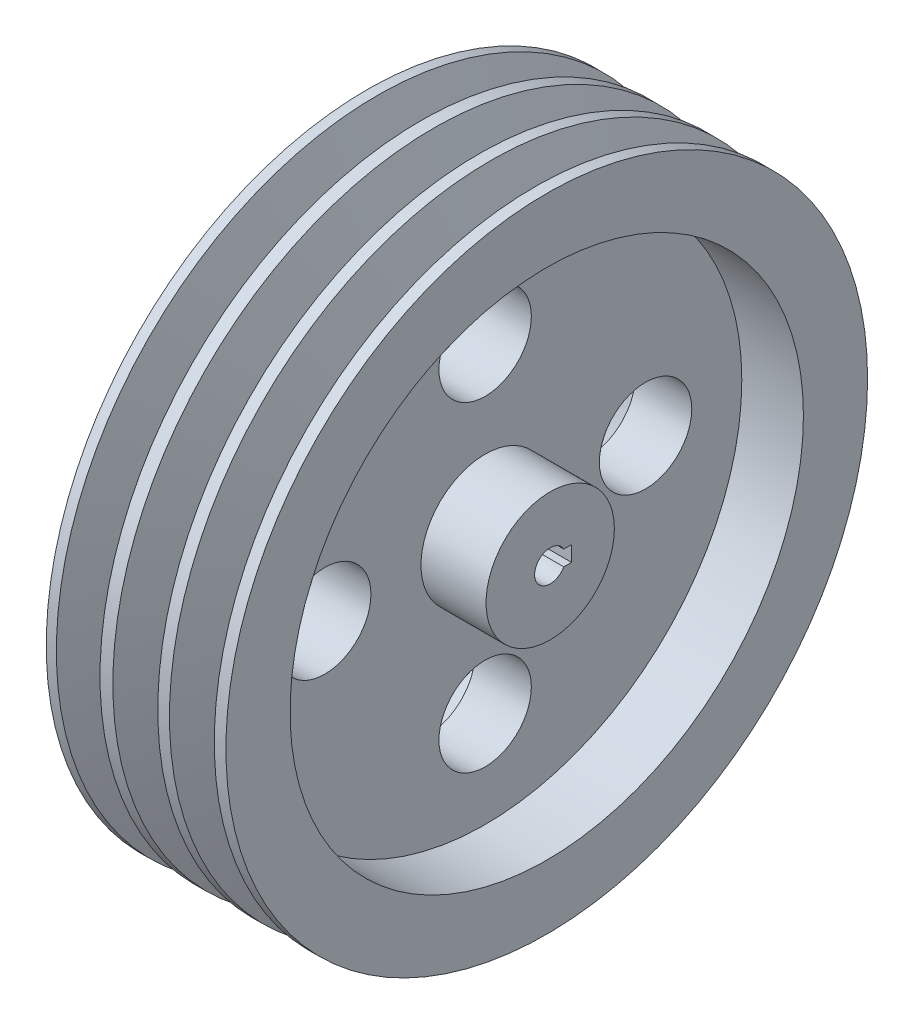
ISO-10303-21;
HEADER;
FILE_DESCRIPTION(('STEP AP214'),'2;1');
FILE_NAME('part.step','',(''),(''),'','','');
FILE_SCHEMA(('AUTOMOTIVE_DESIGN { 1 0 10303 214 1 1 1 1 }'));
ENDSEC;
DATA;
#1=APPLICATION_CONTEXT('core data for automotive mechanical design processes');
#2=APPLICATION_PROTOCOL_DEFINITION('international standard','automotive_design',2000,#1);
#3=PRODUCT_CONTEXT('',#1,'mechanical');
#4=PRODUCT('Part','Part','',(#3));
#5=PRODUCT_RELATED_PRODUCT_CATEGORY('part','',(#4));
#6=PRODUCT_DEFINITION_FORMATION('','',#4);
#7=PRODUCT_DEFINITION_CONTEXT('part definition',#1,'design');
#8=PRODUCT_DEFINITION('design','',#6,#7);
#9=PRODUCT_DEFINITION_SHAPE('','',#8);
#10=(LENGTH_UNIT() NAMED_UNIT(*) SI_UNIT(.MILLI.,.METRE.));
#11=(NAMED_UNIT(*) PLANE_ANGLE_UNIT() SI_UNIT($,.RADIAN.));
#12=(NAMED_UNIT(*) SI_UNIT($,.STERADIAN.) SOLID_ANGLE_UNIT());
#13=UNCERTAINTY_MEASURE_WITH_UNIT(LENGTH_MEASURE(1.E-05),#10,'distance_accuracy_value','');
#14=(GEOMETRIC_REPRESENTATION_CONTEXT(3) GLOBAL_UNCERTAINTY_ASSIGNED_CONTEXT((#13)) GLOBAL_UNIT_ASSIGNED_CONTEXT((#10,
#11,#12)) REPRESENTATION_CONTEXT('',''));
#15=CARTESIAN_POINT('',(0.,0.,0.));
#16=DIRECTION('',(0.,0.,1.));
#17=DIRECTION('',(1.,0.,0.));
#18=AXIS2_PLACEMENT_3D('',#15,#16,#17);
#19=CARTESIAN_POINT('',(0.,0.,0.));
#20=DIRECTION('',(1.,0.,0.));
#21=DIRECTION('',(0.,0.,-1.));
#22=AXIS2_PLACEMENT_3D('',#19,#20,#21);
#23=PLANE('',#22);
#24=CARTESIAN_POINT('',(0.,0.,0.));
#25=DIRECTION('',(1.,0.,0.));
#26=DIRECTION('',(0.,0.,-1.));
#27=AXIS2_PLACEMENT_3D('',#24,#25,#26);
#28=CIRCLE('',#27,25.);
#29=CARTESIAN_POINT('',(0.,0.,-25.));
#30=VERTEX_POINT('',#29);
#31=EDGE_CURVE('E108',#30,#30,#28,.T.);
#32=ORIENTED_EDGE('',*,*,#31,.F.);
#33=EDGE_LOOP('',(#32));
#34=FACE_BOUND('',#33,.T.);
#35=DIRECTION('',(0.,0.,1.));
#36=VECTOR('',#35,1.);
#37=CARTESIAN_POINT('',(0.,-3.,0.));
#38=LINE('',#37,#36);
#39=CARTESIAN_POINT('',(0.,-3.,-8.29200838994542));
#40=VERTEX_POINT('',#39);
#41=CARTESIAN_POINT('',(0.,-3.,-5.29200838994542));
#42=VERTEX_POINT('',#41);
#43=EDGE_CURVE('E188',#40,#42,#38,.T.);
#44=ORIENTED_EDGE('',*,*,#43,.F.);
#45=DIRECTION('',(0.,-1.,0.));
#46=VECTOR('',#45,1.);
#47=CARTESIAN_POINT('',(0.,0.,-8.29200838994542));
#48=LINE('',#47,#46);
#49=CARTESIAN_POINT('',(0.,3.,-8.29200838994542));
#50=VERTEX_POINT('',#49);
#51=EDGE_CURVE('E63',#50,#40,#48,.T.);
#52=ORIENTED_EDGE('',*,*,#51,.F.);
#53=DIRECTION('',(0.,0.,-1.));
#54=VECTOR('',#53,1.);
#55=CARTESIAN_POINT('',(0.,3.,0.));
#56=LINE('',#55,#54);
#57=CARTESIAN_POINT('',(0.,3.00000000000001,-5.29200838994542));
#58=VERTEX_POINT('',#57);
#59=EDGE_CURVE('E186',#58,#50,#56,.T.);
#60=ORIENTED_EDGE('',*,*,#59,.F.);
#61=CARTESIAN_POINT('',(0.,0.,0.));
#62=DIRECTION('',(1.,0.,0.));
#63=DIRECTION('',(0.,0.,-1.));
#64=AXIS2_PLACEMENT_3D('',#61,#62,#63);
#65=CIRCLE('',#64,6.08320251177392);
#66=EDGE_CURVE('E100',#58,#42,#65,.T.);
#67=ORIENTED_EDGE('',*,*,#66,.T.);
#68=EDGE_LOOP('',(#44,#52,#60,#67));
#69=FACE_BOUND('',#68,.T.);
#70=ADVANCED_FACE('F41',(#34,#69),#23,.F.);
#71=CARTESIAN_POINT('',(70.,0.,0.));
#72=DIRECTION('',(1.,0.,0.));
#73=DIRECTION('',(0.,0.,-1.));
#74=AXIS2_PLACEMENT_3D('',#71,#72,#73);
#75=CYLINDRICAL_SURFACE('',#74,6.08320251177393);
#76=CARTESIAN_POINT('',(70.,0.,0.));
#77=DIRECTION('',(1.,0.,0.));
#78=DIRECTION('',(0.,0.,-1.));
#79=AXIS2_PLACEMENT_3D('',#76,#77,#78);
#80=CIRCLE('',#79,6.08320251177394);
#81=CARTESIAN_POINT('',(70.,3.00000000000001,-5.2920083899454));
#82=VERTEX_POINT('',#81);
#83=CARTESIAN_POINT('',(70.,-3.,-5.29200838994541));
#84=VERTEX_POINT('',#83);
#85=EDGE_CURVE('E98',#82,#84,#80,.T.);
#86=ORIENTED_EDGE('',*,*,#85,.T.);
#87=DIRECTION('',(1.,0.,0.));
#88=VECTOR('',#87,1.);
#89=CARTESIAN_POINT('',(-1.34886382225793,-3.,-5.29200838994542));
#90=LINE('',#89,#88);
#91=EDGE_CURVE('E101',#42,#84,#90,.T.);
#92=ORIENTED_EDGE('',*,*,#91,.F.);
#93=ORIENTED_EDGE('',*,*,#66,.F.);
#94=DIRECTION('',(1.,0.,0.));
#95=VECTOR('',#94,1.);
#96=CARTESIAN_POINT('',(-1.34886382225793,3.00000000000001,-5.29200838994542));
#97=LINE('',#96,#95);
#98=EDGE_CURVE('E86',#58,#82,#97,.T.);
#99=ORIENTED_EDGE('',*,*,#98,.T.);
#100=EDGE_LOOP('',(#86,#92,#93,#99));
#101=FACE_BOUND('',#100,.T.);
#102=ADVANCED_FACE('F96',(#101),#75,.F.);
#103=CARTESIAN_POINT('',(70.,0.,0.));
#104=DIRECTION('',(1.,0.,0.));
#105=DIRECTION('',(0.,0.,-1.));
#106=AXIS2_PLACEMENT_3D('',#103,#104,#105);
#107=PLANE('',#106);
#108=CARTESIAN_POINT('',(70.,0.,0.));
#109=DIRECTION('',(1.,0.,0.));
#110=DIRECTION('',(0.,0.,-1.));
#111=AXIS2_PLACEMENT_3D('',#108,#109,#110);
#112=CIRCLE('',#111,25.);
#113=CARTESIAN_POINT('',(70.,0.,-25.));
#114=VERTEX_POINT('',#113);
#115=EDGE_CURVE('E106',#114,#114,#112,.T.);
#116=ORIENTED_EDGE('',*,*,#115,.T.);
#117=EDGE_LOOP('',(#116));
#118=FACE_BOUND('',#117,.T.);
#119=DIRECTION('',(0.,-1.,0.));
#120=VECTOR('',#119,1.);
#121=CARTESIAN_POINT('',(70.,0.,-8.2920083899454));
#122=LINE('',#121,#120);
#123=CARTESIAN_POINT('',(70.,3.,-8.29200838994542));
#124=VERTEX_POINT('',#123);
#125=CARTESIAN_POINT('',(70.,-3.,-8.29200838994541));
#126=VERTEX_POINT('',#125);
#127=EDGE_CURVE('E58',#124,#126,#122,.T.);
#128=ORIENTED_EDGE('',*,*,#127,.T.);
#129=DIRECTION('',(0.,0.,1.));
#130=VECTOR('',#129,1.);
#131=CARTESIAN_POINT('',(70.,-3.,0.));
#132=LINE('',#131,#130);
#133=EDGE_CURVE('E91',#126,#84,#132,.T.);
#134=ORIENTED_EDGE('',*,*,#133,.T.);
#135=ORIENTED_EDGE('',*,*,#85,.F.);
#136=DIRECTION('',(0.,0.,-1.));
#137=VECTOR('',#136,1.);
#138=CARTESIAN_POINT('',(70.,3.,0.));
#139=LINE('',#138,#137);
#140=EDGE_CURVE('E83',#82,#124,#139,.T.);
#141=ORIENTED_EDGE('',*,*,#140,.T.);
#142=EDGE_LOOP('',(#128,#134,#135,#141));
#143=FACE_BOUND('',#142,.T.);
#144=ADVANCED_FACE('F104',(#118,#143),#107,.T.);
#145=CARTESIAN_POINT('',(70.,0.,0.));
#146=DIRECTION('',(1.,0.,0.));
#147=DIRECTION('',(0.,0.,-1.));
#148=AXIS2_PLACEMENT_3D('',#145,#146,#147);
#149=CYLINDRICAL_SURFACE('',#148,125.);
#150=CARTESIAN_POINT('',(64.1219953260686,0.,0.));
#151=DIRECTION('',(1.,0.,0.));
#152=DIRECTION('',(0.,0.,-1.));
#153=AXIS2_PLACEMENT_3D('',#150,#151,#152);
#154=CIRCLE('',#153,125.);
#155=CARTESIAN_POINT('',(64.1219953260687,0.,-125.));
#156=VERTEX_POINT('',#155);
#157=EDGE_CURVE('E11',#156,#156,#154,.T.);
#158=ORIENTED_EDGE('',*,*,#157,.T.);
#159=EDGE_LOOP('',(#158));
#160=FACE_BOUND('',#159,.T.);
#161=CARTESIAN_POINT('',(68.651136177742,0.,0.));
#162=DIRECTION('',(1.,0.,0.));
#163=DIRECTION('',(0.,0.,-1.));
#164=AXIS2_PLACEMENT_3D('',#161,#162,#163);
#165=CIRCLE('',#164,125.);
#166=CARTESIAN_POINT('',(68.6511361777421,0.,-125.));
#167=VERTEX_POINT('',#166);
#168=EDGE_CURVE('E191',#167,#167,#165,.T.);
#169=ORIENTED_EDGE('',*,*,#168,.F.);
#170=EDGE_LOOP('',(#169));
#171=FACE_BOUND('',#170,.T.);
#172=ADVANCED_FACE('F43',(#160,#171),#149,.T.);
#173=CARTESIAN_POINT('',(64.1219953260686,0.,0.));
#174=DIRECTION('',(1.,0.,0.));
#175=DIRECTION('',(0.,0.,-1.));
#176=AXIS2_PLACEMENT_3D('',#173,#174,#175);
#177=CONICAL_SURFACE('',#176,125.,1.21610779152509);
#178=CARTESIAN_POINT('',(57.4556790220797,0.,0.));
#179=DIRECTION('',(1.,0.,0.));
#180=DIRECTION('',(0.,0.,-1.));
#181=AXIS2_PLACEMENT_3D('',#178,#179,#180);
#182=CIRCLE('',#181,107.);
#183=CARTESIAN_POINT('',(57.4556790220797,0.,-107.));
#184=VERTEX_POINT('',#183);
#185=EDGE_CURVE('E50',#184,#184,#182,.T.);
#186=ORIENTED_EDGE('',*,*,#185,.T.);
#187=EDGE_LOOP('',(#186));
#188=FACE_BOUND('',#187,.T.);
#189=ORIENTED_EDGE('',*,*,#157,.F.);
#190=EDGE_LOOP('',(#189));
#191=FACE_BOUND('',#190,.T.);
#192=ADVANCED_FACE('F225',(#188,#191),#177,.T.);
#193=CARTESIAN_POINT('',(70.,0.,0.));
#194=DIRECTION('',(1.,0.,0.));
#195=DIRECTION('',(0.,0.,-1.));
#196=AXIS2_PLACEMENT_3D('',#193,#194,#195);
#197=CYLINDRICAL_SURFACE('',#196,107.);
#198=ORIENTED_EDGE('',*,*,#185,.F.);
#199=EDGE_LOOP('',(#198));
#200=FACE_BOUND('',#199,.T.);
#201=CARTESIAN_POINT('',(53.0899152257052,0.,0.));
#202=DIRECTION('',(1.,0.,0.));
#203=DIRECTION('',(0.,0.,-1.));
#204=AXIS2_PLACEMENT_3D('',#201,#202,#203);
#205=CIRCLE('',#204,107.);
#206=CARTESIAN_POINT('',(53.0899152257052,0.,-107.));
#207=VERTEX_POINT('',#206);
#208=EDGE_CURVE('E156',#207,#207,#205,.T.);
#209=ORIENTED_EDGE('',*,*,#208,.T.);
#210=EDGE_LOOP('',(#209));
#211=FACE_BOUND('',#210,.T.);
#212=ADVANCED_FACE('F231',(#200,#211),#197,.T.);
#213=CARTESIAN_POINT('',(46.6528339639615,0.,0.));
#214=DIRECTION('',(-1.,0.,0.));
#215=DIRECTION('',(0.,0.,1.));
#216=AXIS2_PLACEMENT_3D('',#213,#214,#215);
#217=CONICAL_SURFACE('',#216,125.,1.22735316126697);
#218=ORIENTED_EDGE('',*,*,#208,.F.);
#219=EDGE_LOOP('',(#218));
#220=FACE_BOUND('',#219,.T.);
#221=CARTESIAN_POINT('',(46.6528339639615,0.,0.));
#222=DIRECTION('',(1.,0.,0.));
#223=DIRECTION('',(0.,0.,-1.));
#224=AXIS2_PLACEMENT_3D('',#221,#222,#223);
#225=CIRCLE('',#224,125.);
#226=CARTESIAN_POINT('',(46.6528339639616,0.,-125.));
#227=VERTEX_POINT('',#226);
#228=EDGE_CURVE('E153',#227,#227,#225,.T.);
#229=ORIENTED_EDGE('',*,*,#228,.T.);
#230=EDGE_LOOP('',(#229));
#231=FACE_BOUND('',#230,.T.);
#232=ADVANCED_FACE('F296',(#220,#231),#217,.T.);
#233=CARTESIAN_POINT('',(70.,0.,0.));
#234=DIRECTION('',(1.,0.,0.));
#235=DIRECTION('',(0.,0.,-1.));
#236=AXIS2_PLACEMENT_3D('',#233,#234,#235);
#237=CYLINDRICAL_SURFACE('',#236,125.);
#238=ORIENTED_EDGE('',*,*,#228,.F.);
#239=EDGE_LOOP('',(#238));
#240=FACE_BOUND('',#239,.T.);
#241=CARTESIAN_POINT('',(42.1118112708992,0.,0.));
#242=DIRECTION('',(1.,0.,0.));
#243=DIRECTION('',(0.,0.,-1.));
#244=AXIS2_PLACEMENT_3D('',#241,#242,#243);
#245=CIRCLE('',#244,125.);
#246=CARTESIAN_POINT('',(42.1118112708992,0.,-125.));
#247=VERTEX_POINT('',#246);
#248=EDGE_CURVE('E150',#247,#247,#245,.T.);
#249=ORIENTED_EDGE('',*,*,#248,.T.);
#250=EDGE_LOOP('',(#249));
#251=FACE_BOUND('',#250,.T.);
#252=ADVANCED_FACE('F292',(#240,#251),#237,.T.);
#253=CARTESIAN_POINT('',(36.1183606490001,0.,0.));
#254=DIRECTION('',(1.,0.,0.));
#255=DIRECTION('',(0.,0.,-1.));
#256=AXIS2_PLACEMENT_3D('',#253,#254,#255);
#257=CONICAL_SURFACE('',#256,107.,1.24937327704079);
#258=ORIENTED_EDGE('',*,*,#248,.F.);
#259=EDGE_LOOP('',(#258));
#260=FACE_BOUND('',#259,.T.);
#261=CARTESIAN_POINT('',(36.1183606490001,0.,0.));
#262=DIRECTION('',(1.,0.,0.));
#263=DIRECTION('',(0.,0.,-1.));
#264=AXIS2_PLACEMENT_3D('',#261,#262,#263);
#265=CIRCLE('',#264,107.);
#266=CARTESIAN_POINT('',(36.1183606490001,0.,-107.));
#267=VERTEX_POINT('',#266);
#268=EDGE_CURVE('E147',#267,#267,#265,.T.);
#269=ORIENTED_EDGE('',*,*,#268,.T.);
#270=EDGE_LOOP('',(#269));
#271=FACE_BOUND('',#270,.T.);
#272=ADVANCED_FACE('F288',(#260,#271),#257,.T.);
#273=CARTESIAN_POINT('',(70.,0.,0.));
#274=DIRECTION('',(1.,0.,0.));
#275=DIRECTION('',(0.,0.,-1.));
#276=AXIS2_PLACEMENT_3D('',#273,#274,#275);
#277=CYLINDRICAL_SURFACE('',#276,107.);
#278=ORIENTED_EDGE('',*,*,#268,.F.);
#279=EDGE_LOOP('',(#278));
#280=FACE_BOUND('',#279,.T.);
#281=CARTESIAN_POINT('',(31.7228069267579,0.,0.));
#282=DIRECTION('',(1.,0.,0.));
#283=DIRECTION('',(0.,0.,-1.));
#284=AXIS2_PLACEMENT_3D('',#281,#282,#283);
#285=CIRCLE('',#284,107.);
#286=CARTESIAN_POINT('',(31.722806926758,0.,-107.));
#287=VERTEX_POINT('',#286);
#288=EDGE_CURVE('E144',#287,#287,#285,.T.);
#289=ORIENTED_EDGE('',*,*,#288,.T.);
#290=EDGE_LOOP('',(#289));
#291=FACE_BOUND('',#290,.T.);
#292=ADVANCED_FACE('F284',(#280,#291),#277,.T.);
#293=CARTESIAN_POINT('',(24.6019835512689,0.,0.));
#294=DIRECTION('',(-1.,0.,0.));
#295=DIRECTION('',(0.,0.,1.));
#296=AXIS2_PLACEMENT_3D('',#293,#294,#295);
#297=CONICAL_SURFACE('',#296,125.,1.19408767575128);
#298=ORIENTED_EDGE('',*,*,#288,.F.);
#299=EDGE_LOOP('',(#298));
#300=FACE_BOUND('',#299,.T.);
#301=CARTESIAN_POINT('',(24.6019835512689,0.,0.));
#302=DIRECTION('',(1.,0.,0.));
#303=DIRECTION('',(0.,0.,-1.));
#304=AXIS2_PLACEMENT_3D('',#301,#302,#303);
#305=CIRCLE('',#304,125.);
#306=CARTESIAN_POINT('',(24.6019835512689,0.,-125.));
#307=VERTEX_POINT('',#306);
#308=EDGE_CURVE('E141',#307,#307,#305,.T.);
#309=ORIENTED_EDGE('',*,*,#308,.T.);
#310=EDGE_LOOP('',(#309));
#311=FACE_BOUND('',#310,.T.);
#312=ADVANCED_FACE('F280',(#300,#311),#297,.T.);
#313=CARTESIAN_POINT('',(70.,0.,0.));
#314=DIRECTION('',(1.,0.,0.));
#315=DIRECTION('',(0.,0.,-1.));
#316=AXIS2_PLACEMENT_3D('',#313,#314,#315);
#317=CYLINDRICAL_SURFACE('',#316,125.);
#318=CARTESIAN_POINT('',(19.6019835512689,0.,0.));
#319=DIRECTION('',(1.,0.,0.));
#320=DIRECTION('',(0.,0.,-1.));
#321=AXIS2_PLACEMENT_3D('',#318,#319,#320);
#322=CIRCLE('',#321,125.);
#323=CARTESIAN_POINT('',(19.6019835512689,0.,-125.));
#324=VERTEX_POINT('',#323);
#325=EDGE_CURVE('E138',#324,#324,#322,.T.);
#326=ORIENTED_EDGE('',*,*,#325,.T.);
#327=EDGE_LOOP('',(#326));
#328=FACE_BOUND('',#327,.T.);
#329=ORIENTED_EDGE('',*,*,#308,.F.);
#330=EDGE_LOOP('',(#329));
#331=FACE_BOUND('',#330,.T.);
#332=ADVANCED_FACE('F276',(#328,#331),#317,.T.);
#333=CARTESIAN_POINT('',(12.8500848980716,0.,0.));
#334=DIRECTION('',(1.,0.,0.));
#335=DIRECTION('',(0.,0.,-1.));
#336=AXIS2_PLACEMENT_3D('',#333,#334,#335);
#337=CONICAL_SURFACE('',#336,107.,1.21193318347219);
#338=ORIENTED_EDGE('',*,*,#325,.F.);
#339=EDGE_LOOP('',(#338));
#340=FACE_BOUND('',#339,.T.);
#341=CARTESIAN_POINT('',(12.8500848980716,0.,0.));
#342=DIRECTION('',(1.,0.,0.));
#343=DIRECTION('',(0.,0.,-1.));
#344=AXIS2_PLACEMENT_3D('',#341,#342,#343);
#345=CIRCLE('',#344,107.);
#346=CARTESIAN_POINT('',(12.8500848980716,0.,-107.));
#347=VERTEX_POINT('',#346);
#348=EDGE_CURVE('E135',#347,#347,#345,.T.);
#349=ORIENTED_EDGE('',*,*,#348,.T.);
#350=EDGE_LOOP('',(#349));
#351=FACE_BOUND('',#350,.T.);
#352=ADVANCED_FACE('F272',(#340,#351),#337,.T.);
#353=CARTESIAN_POINT('',(70.,0.,0.));
#354=DIRECTION('',(1.,0.,0.));
#355=DIRECTION('',(0.,0.,-1.));
#356=AXIS2_PLACEMENT_3D('',#353,#354,#355);
#357=CYLINDRICAL_SURFACE('',#356,107.);
#358=ORIENTED_EDGE('',*,*,#348,.F.);
#359=EDGE_LOOP('',(#358));
#360=FACE_BOUND('',#359,.T.);
#361=CARTESIAN_POINT('',(8.9500703896738,0.,0.));
#362=DIRECTION('',(1.,0.,0.));
#363=DIRECTION('',(0.,0.,-1.));
#364=AXIS2_PLACEMENT_3D('',#361,#362,#363);
#365=CIRCLE('',#364,107.);
#366=CARTESIAN_POINT('',(8.95007038967383,0.,-107.));
#367=VERTEX_POINT('',#366);
#368=EDGE_CURVE('E132',#367,#367,#365,.T.);
#369=ORIENTED_EDGE('',*,*,#368,.T.);
#370=EDGE_LOOP('',(#369));
#371=FACE_BOUND('',#370,.T.);
#372=ADVANCED_FACE('F268',(#360,#371),#357,.T.);
#373=CARTESIAN_POINT('',(2.597616175599,0.,0.));
#374=DIRECTION('',(-1.,0.,0.));
#375=DIRECTION('',(0.,0.,1.));
#376=AXIS2_PLACEMENT_3D('',#373,#374,#375);
#377=CONICAL_SURFACE('',#376,125.,1.23152776931987);
#378=ORIENTED_EDGE('',*,*,#368,.F.);
#379=EDGE_LOOP('',(#378));
#380=FACE_BOUND('',#379,.T.);
#381=CARTESIAN_POINT('',(2.597616175599,0.,0.));
#382=DIRECTION('',(1.,0.,0.));
#383=DIRECTION('',(0.,0.,-1.));
#384=AXIS2_PLACEMENT_3D('',#381,#382,#383);
#385=CIRCLE('',#384,125.);
#386=CARTESIAN_POINT('',(2.59761617559903,0.,-125.));
#387=VERTEX_POINT('',#386);
#388=EDGE_CURVE('E129',#387,#387,#385,.T.);
#389=ORIENTED_EDGE('',*,*,#388,.T.);
#390=EDGE_LOOP('',(#389));
#391=FACE_BOUND('',#390,.T.);
#392=ADVANCED_FACE('F264',(#380,#391),#377,.T.);
#393=CARTESIAN_POINT('',(70.,0.,0.));
#394=DIRECTION('',(1.,0.,0.));
#395=DIRECTION('',(0.,0.,-1.));
#396=AXIS2_PLACEMENT_3D('',#393,#394,#395);
#397=CYLINDRICAL_SURFACE('',#396,125.);
#398=CARTESIAN_POINT('',(-1.34886382225793,0.,0.));
#399=DIRECTION('',(1.,0.,0.));
#400=DIRECTION('',(0.,0.,-1.));
#401=AXIS2_PLACEMENT_3D('',#398,#399,#400);
#402=CIRCLE('',#401,125.);
#403=CARTESIAN_POINT('',(-1.34886382225791,0.,-125.));
#404=VERTEX_POINT('',#403);
#405=EDGE_CURVE('E126',#404,#404,#402,.T.);
#406=ORIENTED_EDGE('',*,*,#405,.T.);
#407=EDGE_LOOP('',(#406));
#408=FACE_BOUND('',#407,.T.);
#409=ORIENTED_EDGE('',*,*,#388,.F.);
#410=EDGE_LOOP('',(#409));
#411=FACE_BOUND('',#410,.T.);
#412=ADVANCED_FACE('F260',(#408,#411),#397,.T.);
#413=CARTESIAN_POINT('',(-1.34886382225793,0.,0.));
#414=DIRECTION('',(1.,0.,0.));
#415=DIRECTION('',(0.,0.,-1.));
#416=AXIS2_PLACEMENT_3D('',#413,#414,#415);
#417=PLANE('',#416);
#418=ORIENTED_EDGE('',*,*,#405,.F.);
#419=EDGE_LOOP('',(#418));
#420=FACE_BOUND('',#419,.T.);
#421=CARTESIAN_POINT('',(-1.34886382225793,0.,0.));
#422=DIRECTION('',(1.,0.,0.));
#423=DIRECTION('',(0.,0.,-1.));
#424=AXIS2_PLACEMENT_3D('',#421,#422,#423);
#425=CIRCLE('',#424,100.);
#426=CARTESIAN_POINT('',(-1.34886382225791,0.,-100.));
#427=VERTEX_POINT('',#426);
#428=EDGE_CURVE('E123',#427,#427,#425,.T.);
#429=ORIENTED_EDGE('',*,*,#428,.T.);
#430=EDGE_LOOP('',(#429));
#431=FACE_BOUND('',#430,.T.);
#432=ADVANCED_FACE('F256',(#420,#431),#417,.F.);
#433=CARTESIAN_POINT('',(70.,0.,0.));
#434=DIRECTION('',(1.,0.,0.));
#435=DIRECTION('',(0.,0.,-1.));
#436=AXIS2_PLACEMENT_3D('',#433,#434,#435);
#437=CYLINDRICAL_SURFACE('',#436,100.);
#438=CARTESIAN_POINT('',(22.6511361777421,0.,0.));
#439=DIRECTION('',(1.,0.,0.));
#440=DIRECTION('',(0.,0.,-1.));
#441=AXIS2_PLACEMENT_3D('',#438,#439,#440);
#442=CIRCLE('',#441,100.);
#443=CARTESIAN_POINT('',(22.6511361777421,0.,-100.));
#444=VERTEX_POINT('',#443);
#445=EDGE_CURVE('E120',#444,#444,#442,.T.);
#446=ORIENTED_EDGE('',*,*,#445,.T.);
#447=EDGE_LOOP('',(#446));
#448=FACE_BOUND('',#447,.T.);
#449=ORIENTED_EDGE('',*,*,#428,.F.);
#450=EDGE_LOOP('',(#449));
#451=FACE_BOUND('',#450,.T.);
#452=ADVANCED_FACE('F252',(#448,#451),#437,.F.);
#453=CARTESIAN_POINT('',(22.6511361777421,0.,0.));
#454=DIRECTION('',(1.,0.,0.));
#455=DIRECTION('',(0.,0.,-1.));
#456=AXIS2_PLACEMENT_3D('',#453,#454,#455);
#457=PLANE('',#456);
#458=CARTESIAN_POINT('',(22.6511361777421,1.76487577565824E-12,-62.5000000000018));
#459=DIRECTION('',(1.,0.,0.));
#460=DIRECTION('',(0.,0.,-1.));
#461=AXIS2_PLACEMENT_3D('',#458,#459,#460);
#462=CIRCLE('',#461,18.0000000000014);
#463=CARTESIAN_POINT('',(22.6511361777421,1.76487577565824E-12,-80.5000000000031));
#464=VERTEX_POINT('',#463);
#465=EDGE_CURVE('E183',#464,#464,#462,.T.);
#466=ORIENTED_EDGE('',*,*,#465,.T.);
#467=EDGE_LOOP('',(#466));
#468=FACE_BOUND('',#467,.T.);
#469=CARTESIAN_POINT('',(22.6511361777421,62.5,0.));
#470=DIRECTION('',(1.,0.,0.));
#471=DIRECTION('',(0.,0.,-1.));
#472=AXIS2_PLACEMENT_3D('',#469,#470,#471);
#473=CIRCLE('',#472,18.);
#474=CARTESIAN_POINT('',(22.6511361777421,62.5,-18.));
#475=VERTEX_POINT('',#474);
#476=EDGE_CURVE('E171',#475,#475,#473,.T.);
#477=ORIENTED_EDGE('',*,*,#476,.T.);
#478=EDGE_LOOP('',(#477));
#479=FACE_BOUND('',#478,.T.);
#480=CARTESIAN_POINT('',(22.6511361777421,-62.5,-3.5249802028833E-12));
#481=DIRECTION('',(1.,0.,0.));
#482=DIRECTION('',(0.,0.,-1.));
#483=AXIS2_PLACEMENT_3D('',#480,#481,#482);
#484=CIRCLE('',#483,18.0000000000038);
#485=CARTESIAN_POINT('',(22.6511361777421,-62.5,-18.0000000000073));
#486=VERTEX_POINT('',#485);
#487=EDGE_CURVE('E168',#486,#486,#484,.T.);
#488=ORIENTED_EDGE('',*,*,#487,.T.);
#489=EDGE_LOOP('',(#488));
#490=FACE_BOUND('',#489,.T.);
#491=CARTESIAN_POINT('',(22.6511361777421,-1.77252981815291E-12,62.4999999999982));
#492=DIRECTION('',(1.,0.,0.));
#493=DIRECTION('',(0.,0.,-1.));
#494=AXIS2_PLACEMENT_3D('',#491,#492,#493);
#495=CIRCLE('',#494,18.0000000000028);
#496=CARTESIAN_POINT('',(22.6511361777421,-1.77252981815291E-12,44.4999999999954));
#497=VERTEX_POINT('',#496);
#498=EDGE_CURVE('E164',#497,#497,#495,.T.);
#499=ORIENTED_EDGE('',*,*,#498,.T.);
#500=EDGE_LOOP('',(#499));
#501=FACE_BOUND('',#500,.T.);
#502=ORIENTED_EDGE('',*,*,#445,.F.);
#503=EDGE_LOOP('',(#502));
#504=FACE_BOUND('',#503,.T.);
#505=CARTESIAN_POINT('',(22.6511361777421,0.,0.));
#506=DIRECTION('',(1.,0.,0.));
#507=DIRECTION('',(0.,0.,-1.));
#508=AXIS2_PLACEMENT_3D('',#505,#506,#507);
#509=CIRCLE('',#508,25.);
#510=CARTESIAN_POINT('',(22.6511361777421,0.,-25.));
#511=VERTEX_POINT('',#510);
#512=EDGE_CURVE('E117',#511,#511,#509,.T.);
#513=ORIENTED_EDGE('',*,*,#512,.T.);
#514=EDGE_LOOP('',(#513));
#515=FACE_BOUND('',#514,.T.);
#516=ADVANCED_FACE('F248',(#468,#479,#490,#501,#504,#515),#457,.F.);
#517=CARTESIAN_POINT('',(70.,0.,0.));
#518=DIRECTION('',(1.,0.,0.));
#519=DIRECTION('',(0.,0.,-1.));
#520=AXIS2_PLACEMENT_3D('',#517,#518,#519);
#521=CYLINDRICAL_SURFACE('',#520,25.);
#522=ORIENTED_EDGE('',*,*,#31,.T.);
#523=EDGE_LOOP('',(#522));
#524=FACE_BOUND('',#523,.T.);
#525=ORIENTED_EDGE('',*,*,#512,.F.);
#526=EDGE_LOOP('',(#525));
#527=FACE_BOUND('',#526,.T.);
#528=ADVANCED_FACE('F245',(#524,#527),#521,.T.);
#529=CARTESIAN_POINT('',(70.,0.,0.));
#530=DIRECTION('',(1.,0.,0.));
#531=DIRECTION('',(0.,0.,-1.));
#532=AXIS2_PLACEMENT_3D('',#529,#530,#531);
#533=CYLINDRICAL_SURFACE('',#532,25.);
#534=ORIENTED_EDGE('',*,*,#115,.F.);
#535=EDGE_LOOP('',(#534));
#536=FACE_BOUND('',#535,.T.);
#537=CARTESIAN_POINT('',(44.6511361777421,0.,0.));
#538=DIRECTION('',(1.,0.,0.));
#539=DIRECTION('',(0.,0.,-1.));
#540=AXIS2_PLACEMENT_3D('',#537,#538,#539);
#541=CIRCLE('',#540,25.);
#542=CARTESIAN_POINT('',(44.6511361777421,0.,-25.));
#543=VERTEX_POINT('',#542);
#544=EDGE_CURVE('E111',#543,#543,#541,.T.);
#545=ORIENTED_EDGE('',*,*,#544,.T.);
#546=EDGE_LOOP('',(#545));
#547=FACE_BOUND('',#546,.T.);
#548=ADVANCED_FACE('F202',(#536,#547),#533,.T.);
#549=CARTESIAN_POINT('',(44.6511361777421,0.,0.));
#550=DIRECTION('',(-1.,0.,0.));
#551=DIRECTION('',(0.,0.,1.));
#552=AXIS2_PLACEMENT_3D('',#549,#550,#551);
#553=PLANE('',#552);
#554=CARTESIAN_POINT('',(44.6511361777421,1.76487577565824E-12,-62.5000000000017));
#555=DIRECTION('',(-1.,0.,0.));
#556=DIRECTION('',(0.,0.,1.));
#557=AXIS2_PLACEMENT_3D('',#554,#555,#556);
#558=CIRCLE('',#557,18.0000000000014);
#559=CARTESIAN_POINT('',(44.6511361777421,1.76487577565824E-12,-44.5000000000004));
#560=VERTEX_POINT('',#559);
#561=EDGE_CURVE('E45',#560,#560,#558,.T.);
#562=ORIENTED_EDGE('',*,*,#561,.T.);
#563=EDGE_LOOP('',(#562));
#564=FACE_BOUND('',#563,.T.);
#565=CARTESIAN_POINT('',(44.6511361777421,62.5,0.));
#566=DIRECTION('',(-1.,0.,0.));
#567=DIRECTION('',(0.,0.,1.));
#568=AXIS2_PLACEMENT_3D('',#565,#566,#567);
#569=CIRCLE('',#568,18.);
#570=CARTESIAN_POINT('',(44.6511361777421,62.5,18.));
#571=VERTEX_POINT('',#570);
#572=EDGE_CURVE('E169',#571,#571,#569,.T.);
#573=ORIENTED_EDGE('',*,*,#572,.T.);
#574=EDGE_LOOP('',(#573));
#575=FACE_BOUND('',#574,.T.);
#576=CARTESIAN_POINT('',(44.6511361777421,-62.5,-3.52034601302605E-12));
#577=DIRECTION('',(-1.,0.,0.));
#578=DIRECTION('',(0.,0.,1.));
#579=AXIS2_PLACEMENT_3D('',#576,#577,#578);
#580=CIRCLE('',#579,18.0000000000038);
#581=CARTESIAN_POINT('',(44.6511361777421,-62.5,18.0000000000003));
#582=VERTEX_POINT('',#581);
#583=EDGE_CURVE('E166',#582,#582,#580,.T.);
#584=ORIENTED_EDGE('',*,*,#583,.T.);
#585=EDGE_LOOP('',(#584));
#586=FACE_BOUND('',#585,.T.);
#587=CARTESIAN_POINT('',(44.6511361777421,-1.77252981815291E-12,62.4999999999982));
#588=DIRECTION('',(-1.,0.,0.));
#589=DIRECTION('',(0.,0.,1.));
#590=AXIS2_PLACEMENT_3D('',#587,#588,#589);
#591=CIRCLE('',#590,18.0000000000028);
#592=CARTESIAN_POINT('',(44.6511361777421,-1.77252981815291E-12,80.5000000000011));
#593=VERTEX_POINT('',#592);
#594=EDGE_CURVE('E161',#593,#593,#591,.T.);
#595=ORIENTED_EDGE('',*,*,#594,.T.);
#596=EDGE_LOOP('',(#595));
#597=FACE_BOUND('',#596,.T.);
#598=ORIENTED_EDGE('',*,*,#544,.F.);
#599=EDGE_LOOP('',(#598));
#600=FACE_BOUND('',#599,.T.);
#601=CARTESIAN_POINT('',(44.6511361777421,0.,0.));
#602=DIRECTION('',(1.,0.,0.));
#603=DIRECTION('',(0.,0.,-1.));
#604=AXIS2_PLACEMENT_3D('',#601,#602,#603);
#605=CIRCLE('',#604,100.);
#606=CARTESIAN_POINT('',(44.6511361777421,0.,-100.));
#607=VERTEX_POINT('',#606);
#608=EDGE_CURVE('E197',#607,#607,#605,.T.);
#609=ORIENTED_EDGE('',*,*,#608,.T.);
#610=EDGE_LOOP('',(#609));
#611=FACE_BOUND('',#610,.T.);
#612=ADVANCED_FACE('F204',(#564,#575,#586,#597,#600,#611),#553,.F.);
#613=CARTESIAN_POINT('',(70.,0.,0.));
#614=DIRECTION('',(1.,0.,0.));
#615=DIRECTION('',(0.,0.,-1.));
#616=AXIS2_PLACEMENT_3D('',#613,#614,#615);
#617=CYLINDRICAL_SURFACE('',#616,100.);
#618=ORIENTED_EDGE('',*,*,#608,.F.);
#619=EDGE_LOOP('',(#618));
#620=FACE_BOUND('',#619,.T.);
#621=CARTESIAN_POINT('',(68.651136177742,0.,0.));
#622=DIRECTION('',(1.,0.,0.));
#623=DIRECTION('',(0.,0.,-1.));
#624=AXIS2_PLACEMENT_3D('',#621,#622,#623);
#625=CIRCLE('',#624,100.);
#626=CARTESIAN_POINT('',(68.6511361777421,0.,-100.));
#627=VERTEX_POINT('',#626);
#628=EDGE_CURVE('E194',#627,#627,#625,.T.);
#629=ORIENTED_EDGE('',*,*,#628,.T.);
#630=EDGE_LOOP('',(#629));
#631=FACE_BOUND('',#630,.T.);
#632=ADVANCED_FACE('F207',(#620,#631),#617,.F.);
#633=CARTESIAN_POINT('',(68.651136177742,0.,0.));
#634=DIRECTION('',(-1.,0.,0.));
#635=DIRECTION('',(0.,0.,1.));
#636=AXIS2_PLACEMENT_3D('',#633,#634,#635);
#637=PLANE('',#636);
#638=ORIENTED_EDGE('',*,*,#628,.F.);
#639=EDGE_LOOP('',(#638));
#640=FACE_BOUND('',#639,.T.);
#641=ORIENTED_EDGE('',*,*,#168,.T.);
#642=EDGE_LOOP('',(#641));
#643=FACE_BOUND('',#642,.T.);
#644=ADVANCED_FACE('F214',(#640,#643),#637,.F.);
#645=CARTESIAN_POINT('',(-1.34886382225795,-1.77252981815291E-12,62.4999999999982));
#646=DIRECTION('',(1.,0.,0.));
#647=DIRECTION('',(0.,0.,-1.));
#648=AXIS2_PLACEMENT_3D('',#645,#646,#647);
#649=CYLINDRICAL_SURFACE('',#648,18.0000000000028);
#650=ORIENTED_EDGE('',*,*,#594,.F.);
#651=EDGE_LOOP('',(#650));
#652=FACE_BOUND('',#651,.T.);
#653=ORIENTED_EDGE('',*,*,#498,.F.);
#654=EDGE_LOOP('',(#653));
#655=FACE_BOUND('',#654,.T.);
#656=ADVANCED_FACE('F220',(#652,#655),#649,.F.);
#657=CARTESIAN_POINT('',(-1.34886382225793,-62.5,-3.53003568272758E-12));
#658=DIRECTION('',(1.,0.,0.));
#659=DIRECTION('',(0.,0.,-1.));
#660=AXIS2_PLACEMENT_3D('',#657,#658,#659);
#661=CYLINDRICAL_SURFACE('',#660,18.0000000000038);
#662=ORIENTED_EDGE('',*,*,#583,.F.);
#663=EDGE_LOOP('',(#662));
#664=FACE_BOUND('',#663,.T.);
#665=ORIENTED_EDGE('',*,*,#487,.F.);
#666=EDGE_LOOP('',(#665));
#667=FACE_BOUND('',#666,.T.);
#668=ADVANCED_FACE('F405',(#664,#667),#661,.F.);
#669=CARTESIAN_POINT('',(-1.34886382225793,62.5,0.));
#670=DIRECTION('',(1.,0.,0.));
#671=DIRECTION('',(0.,0.,-1.));
#672=AXIS2_PLACEMENT_3D('',#669,#670,#671);
#673=CYLINDRICAL_SURFACE('',#672,18.);
#674=ORIENTED_EDGE('',*,*,#572,.F.);
#675=EDGE_LOOP('',(#674));
#676=FACE_BOUND('',#675,.T.);
#677=ORIENTED_EDGE('',*,*,#476,.F.);
#678=EDGE_LOOP('',(#677));
#679=FACE_BOUND('',#678,.T.);
#680=ADVANCED_FACE('F413',(#676,#679),#673,.F.);
#681=CARTESIAN_POINT('',(-1.34886382225792,1.76487577565824E-12,-62.5000000000018));
#682=DIRECTION('',(1.,0.,0.));
#683=DIRECTION('',(0.,0.,-1.));
#684=AXIS2_PLACEMENT_3D('',#681,#682,#683);
#685=CYLINDRICAL_SURFACE('',#684,18.0000000000014);
#686=ORIENTED_EDGE('',*,*,#561,.F.);
#687=EDGE_LOOP('',(#686));
#688=FACE_BOUND('',#687,.T.);
#689=ORIENTED_EDGE('',*,*,#465,.F.);
#690=EDGE_LOOP('',(#689));
#691=FACE_BOUND('',#690,.T.);
#692=ADVANCED_FACE('F421',(#688,#691),#685,.F.);
#693=CARTESIAN_POINT('',(-1.34886382225793,0.,-8.29200838994542));
#694=DIRECTION('',(0.,0.,1.));
#695=DIRECTION('',(0.,-1.,0.));
#696=AXIS2_PLACEMENT_3D('',#693,#694,#695);
#697=PLANE('',#696);
#698=ORIENTED_EDGE('',*,*,#51,.T.);
#699=DIRECTION('',(1.,0.,0.));
#700=VECTOR('',#699,1.);
#701=CARTESIAN_POINT('',(-1.34886382225793,-3.,-8.29200838994542));
#702=LINE('',#701,#700);
#703=EDGE_CURVE('E165',#40,#126,#702,.T.);
#704=ORIENTED_EDGE('',*,*,#703,.T.);
#705=ORIENTED_EDGE('',*,*,#127,.F.);
#706=DIRECTION('',(1.,0.,0.));
#707=VECTOR('',#706,1.);
#708=CARTESIAN_POINT('',(-1.34886382225793,3.,-8.29200838994542));
#709=LINE('',#708,#707);
#710=EDGE_CURVE('E88',#50,#124,#709,.T.);
#711=ORIENTED_EDGE('',*,*,#710,.F.);
#712=EDGE_LOOP('',(#698,#704,#705,#711));
#713=FACE_BOUND('',#712,.T.);
#714=ADVANCED_FACE('F429',(#713),#697,.T.);
#715=CARTESIAN_POINT('',(-1.34886382225793,-3.,0.));
#716=DIRECTION('',(0.,1.,0.));
#717=DIRECTION('',(0.,0.,1.));
#718=AXIS2_PLACEMENT_3D('',#715,#716,#717);
#719=PLANE('',#718);
#720=ORIENTED_EDGE('',*,*,#43,.T.);
#721=ORIENTED_EDGE('',*,*,#91,.T.);
#722=ORIENTED_EDGE('',*,*,#133,.F.);
#723=ORIENTED_EDGE('',*,*,#703,.F.);
#724=EDGE_LOOP('',(#720,#721,#722,#723));
#725=FACE_BOUND('',#724,.T.);
#726=ADVANCED_FACE('F437',(#725),#719,.T.);
#727=CARTESIAN_POINT('',(-1.34886382225793,3.,0.));
#728=DIRECTION('',(0.,-1.,0.));
#729=DIRECTION('',(0.,0.,-1.));
#730=AXIS2_PLACEMENT_3D('',#727,#728,#729);
#731=PLANE('',#730);
#732=ORIENTED_EDGE('',*,*,#59,.T.);
#733=ORIENTED_EDGE('',*,*,#710,.T.);
#734=ORIENTED_EDGE('',*,*,#140,.F.);
#735=ORIENTED_EDGE('',*,*,#98,.F.);
#736=EDGE_LOOP('',(#732,#733,#734,#735));
#737=FACE_BOUND('',#736,.T.);
#738=ADVANCED_FACE('F85',(#737),#731,.T.);
#739=CLOSED_SHELL('',(#70,#102,#144,#172,#192,#212,#232,#252,#272,#292,#312,#332,#352,#372,#392,
#412,#432,#452,#516,#528,#548,#612,#632,#644,#656,#668,#680,#692,#714,#726,#738));
#740=MANIFOLD_SOLID_BREP('B2',#739);
#741=ADVANCED_BREP_SHAPE_REPRESENTATION('',(#18,#740),#14);
#742=SHAPE_DEFINITION_REPRESENTATION(#9,#741);
ENDSEC;
END-ISO-10303-21;
